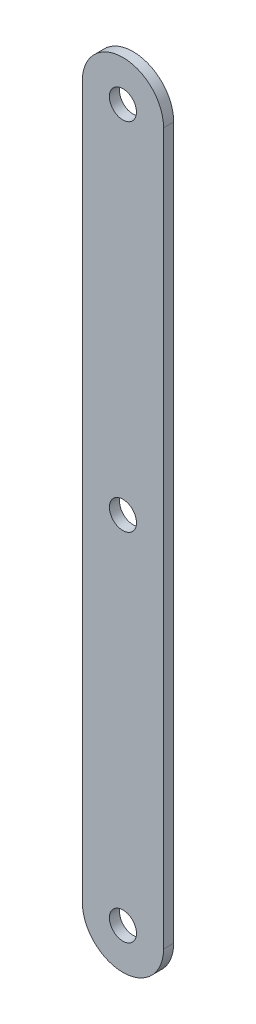
ISO-10303-21;
HEADER;
FILE_DESCRIPTION(('STEP AP214'),'2;1');
FILE_NAME('part.step','',(''),(''),'','','');
FILE_SCHEMA(('AUTOMOTIVE_DESIGN { 1 0 10303 214 1 1 1 1 }'));
ENDSEC;
DATA;
#1=APPLICATION_CONTEXT('core data for automotive mechanical design processes');
#2=APPLICATION_PROTOCOL_DEFINITION('international standard','automotive_design',2000,#1);
#3=PRODUCT_CONTEXT('',#1,'mechanical');
#4=PRODUCT('Part','Part','',(#3));
#5=PRODUCT_RELATED_PRODUCT_CATEGORY('part','',(#4));
#6=PRODUCT_DEFINITION_FORMATION('','',#4);
#7=PRODUCT_DEFINITION_CONTEXT('part definition',#1,'design');
#8=PRODUCT_DEFINITION('design','',#6,#7);
#9=PRODUCT_DEFINITION_SHAPE('','',#8);
#10=(LENGTH_UNIT() NAMED_UNIT(*) SI_UNIT(.MILLI.,.METRE.));
#11=(NAMED_UNIT(*) PLANE_ANGLE_UNIT() SI_UNIT($,.RADIAN.));
#12=(NAMED_UNIT(*) SI_UNIT($,.STERADIAN.) SOLID_ANGLE_UNIT());
#13=UNCERTAINTY_MEASURE_WITH_UNIT(LENGTH_MEASURE(1.E-05),#10,'distance_accuracy_value','');
#14=(GEOMETRIC_REPRESENTATION_CONTEXT(3) GLOBAL_UNCERTAINTY_ASSIGNED_CONTEXT((#13)) GLOBAL_UNIT_ASSIGNED_CONTEXT((#10,
#11,#12)) REPRESENTATION_CONTEXT('',''));
#15=CARTESIAN_POINT('',(0.,0.,0.));
#16=DIRECTION('',(0.,0.,1.));
#17=DIRECTION('',(1.,0.,0.));
#18=AXIS2_PLACEMENT_3D('',#15,#16,#17);
#19=CARTESIAN_POINT('',(0.,-105.,1.5));
#20=DIRECTION('',(0.,0.,-1.));
#21=DIRECTION('',(-1.,0.,0.));
#22=AXIS2_PLACEMENT_3D('',#19,#20,#21);
#23=CYLINDRICAL_SURFACE('',#22,12.);
#24=CARTESIAN_POINT('',(0.,-105.,-1.5));
#25=DIRECTION('',(0.,0.,-1.));
#26=DIRECTION('',(-1.,0.,0.));
#27=AXIS2_PLACEMENT_3D('',#24,#25,#26);
#28=CIRCLE('',#27,12.);
#29=CARTESIAN_POINT('',(12.,-105.,-1.5));
#30=VERTEX_POINT('',#29);
#31=CARTESIAN_POINT('',(-12.,-105.,-1.5));
#32=VERTEX_POINT('',#31);
#33=EDGE_CURVE('E110',#30,#32,#28,.T.);
#34=ORIENTED_EDGE('',*,*,#33,.F.);
#35=DIRECTION('',(0.,0.,-1.));
#36=VECTOR('',#35,1.);
#37=CARTESIAN_POINT('',(12.,-105.,1.5));
#38=LINE('',#37,#36);
#39=CARTESIAN_POINT('',(12.,-105.,1.5));
#40=VERTEX_POINT('',#39);
#41=EDGE_CURVE('E13',#40,#30,#38,.T.);
#42=ORIENTED_EDGE('',*,*,#41,.F.);
#43=CARTESIAN_POINT('',(0.,-105.,1.5));
#44=DIRECTION('',(0.,0.,-1.));
#45=DIRECTION('',(-1.,0.,0.));
#46=AXIS2_PLACEMENT_3D('',#43,#44,#45);
#47=CIRCLE('',#46,12.);
#48=CARTESIAN_POINT('',(-12.,-105.,1.5));
#49=VERTEX_POINT('',#48);
#50=EDGE_CURVE('E103',#40,#49,#47,.T.);
#51=ORIENTED_EDGE('',*,*,#50,.T.);
#52=DIRECTION('',(0.,0.,-1.));
#53=VECTOR('',#52,1.);
#54=CARTESIAN_POINT('',(-12.,-105.,1.5));
#55=LINE('',#54,#53);
#56=EDGE_CURVE('E48',#49,#32,#55,.T.);
#57=ORIENTED_EDGE('',*,*,#56,.T.);
#58=EDGE_LOOP('',(#34,#42,#51,#57));
#59=FACE_BOUND('',#58,.T.);
#60=ADVANCED_FACE('F45',(#59),#23,.T.);
#61=CARTESIAN_POINT('',(12.,105.,1.5));
#62=DIRECTION('',(1.,0.,0.));
#63=DIRECTION('',(0.,0.,-1.));
#64=AXIS2_PLACEMENT_3D('',#61,#62,#63);
#65=PLANE('',#64);
#66=DIRECTION('',(0.,-1.,0.));
#67=VECTOR('',#66,1.);
#68=CARTESIAN_POINT('',(12.,105.,-1.5));
#69=LINE('',#68,#67);
#70=CARTESIAN_POINT('',(12.,105.,-1.5));
#71=VERTEX_POINT('',#70);
#72=EDGE_CURVE('E105',#71,#30,#69,.T.);
#73=ORIENTED_EDGE('',*,*,#72,.F.);
#74=DIRECTION('',(0.,0.,-1.));
#75=VECTOR('',#74,1.);
#76=CARTESIAN_POINT('',(12.,105.,1.5));
#77=LINE('',#76,#75);
#78=CARTESIAN_POINT('',(12.,105.,1.5));
#79=VERTEX_POINT('',#78);
#80=EDGE_CURVE('E54',#79,#71,#77,.T.);
#81=ORIENTED_EDGE('',*,*,#80,.F.);
#82=DIRECTION('',(0.,-1.,0.));
#83=VECTOR('',#82,1.);
#84=CARTESIAN_POINT('',(12.,105.,1.5));
#85=LINE('',#84,#83);
#86=EDGE_CURVE('E100',#79,#40,#85,.T.);
#87=ORIENTED_EDGE('',*,*,#86,.T.);
#88=ORIENTED_EDGE('',*,*,#41,.T.);
#89=EDGE_LOOP('',(#73,#81,#87,#88));
#90=FACE_BOUND('',#89,.T.);
#91=ADVANCED_FACE('F121',(#90),#65,.T.);
#92=CARTESIAN_POINT('',(0.,105.,1.5));
#93=DIRECTION('',(0.,0.,-1.));
#94=DIRECTION('',(-1.,0.,0.));
#95=AXIS2_PLACEMENT_3D('',#92,#93,#94);
#96=CYLINDRICAL_SURFACE('',#95,12.);
#97=CARTESIAN_POINT('',(0.,105.,-1.5));
#98=DIRECTION('',(0.,0.,-1.));
#99=DIRECTION('',(-1.,0.,0.));
#100=AXIS2_PLACEMENT_3D('',#97,#98,#99);
#101=CIRCLE('',#100,12.);
#102=CARTESIAN_POINT('',(-12.,105.,-1.5));
#103=VERTEX_POINT('',#102);
#104=EDGE_CURVE('E95',#103,#71,#101,.T.);
#105=ORIENTED_EDGE('',*,*,#104,.F.);
#106=DIRECTION('',(0.,0.,-1.));
#107=VECTOR('',#106,1.);
#108=CARTESIAN_POINT('',(-12.,105.,1.5));
#109=LINE('',#108,#107);
#110=CARTESIAN_POINT('',(-12.,105.,1.5));
#111=VERTEX_POINT('',#110);
#112=EDGE_CURVE('E90',#111,#103,#109,.T.);
#113=ORIENTED_EDGE('',*,*,#112,.F.);
#114=CARTESIAN_POINT('',(0.,105.,1.5));
#115=DIRECTION('',(0.,0.,-1.));
#116=DIRECTION('',(-1.,0.,0.));
#117=AXIS2_PLACEMENT_3D('',#114,#115,#116);
#118=CIRCLE('',#117,12.);
#119=EDGE_CURVE('E93',#111,#79,#118,.T.);
#120=ORIENTED_EDGE('',*,*,#119,.T.);
#121=ORIENTED_EDGE('',*,*,#80,.T.);
#122=EDGE_LOOP('',(#105,#113,#120,#121));
#123=FACE_BOUND('',#122,.T.);
#124=ADVANCED_FACE('F92',(#123),#96,.T.);
#125=CARTESIAN_POINT('',(-12.,-105.,1.5));
#126=DIRECTION('',(-1.,0.,0.));
#127=DIRECTION('',(0.,0.,1.));
#128=AXIS2_PLACEMENT_3D('',#125,#126,#127);
#129=PLANE('',#128);
#130=DIRECTION('',(0.,1.,0.));
#131=VECTOR('',#130,1.);
#132=CARTESIAN_POINT('',(-12.,-105.,-1.5));
#133=LINE('',#132,#131);
#134=EDGE_CURVE('E113',#32,#103,#133,.T.);
#135=ORIENTED_EDGE('',*,*,#134,.F.);
#136=ORIENTED_EDGE('',*,*,#56,.F.);
#137=DIRECTION('',(0.,1.,0.));
#138=VECTOR('',#137,1.);
#139=CARTESIAN_POINT('',(-12.,-105.,1.5));
#140=LINE('',#139,#138);
#141=EDGE_CURVE('E99',#49,#111,#140,.T.);
#142=ORIENTED_EDGE('',*,*,#141,.T.);
#143=ORIENTED_EDGE('',*,*,#112,.T.);
#144=EDGE_LOOP('',(#135,#136,#142,#143));
#145=FACE_BOUND('',#144,.T.);
#146=ADVANCED_FACE('F102',(#145),#129,.T.);
#147=CARTESIAN_POINT('',(0.,-105.,1.5));
#148=DIRECTION('',(0.,0.,-1.));
#149=DIRECTION('',(-1.,0.,0.));
#150=AXIS2_PLACEMENT_3D('',#147,#148,#149);
#151=PLANE('',#150);
#152=CARTESIAN_POINT('',(0.,105.,1.5));
#153=DIRECTION('',(0.,0.,-1.));
#154=DIRECTION('',(1.,0.,0.));
#155=AXIS2_PLACEMENT_3D('',#152,#153,#154);
#156=CIRCLE('',#155,4.);
#157=CARTESIAN_POINT('',(3.99999999999999,105.,1.5));
#158=VERTEX_POINT('',#157);
#159=EDGE_CURVE('E158',#158,#158,#156,.T.);
#160=ORIENTED_EDGE('',*,*,#159,.T.);
#161=EDGE_LOOP('',(#160));
#162=FACE_BOUND('',#161,.T.);
#163=CARTESIAN_POINT('',(0.,0.,1.5));
#164=DIRECTION('',(0.,0.,-1.));
#165=DIRECTION('',(1.,0.,0.));
#166=AXIS2_PLACEMENT_3D('',#163,#164,#165);
#167=CIRCLE('',#166,4.);
#168=CARTESIAN_POINT('',(4.,0.,1.5));
#169=VERTEX_POINT('',#168);
#170=EDGE_CURVE('E166',#169,#169,#167,.T.);
#171=ORIENTED_EDGE('',*,*,#170,.T.);
#172=EDGE_LOOP('',(#171));
#173=FACE_BOUND('',#172,.T.);
#174=CARTESIAN_POINT('',(0.,-105.,1.5));
#175=DIRECTION('',(0.,0.,-1.));
#176=DIRECTION('',(1.,0.,0.));
#177=AXIS2_PLACEMENT_3D('',#174,#175,#176);
#178=CIRCLE('',#177,4.);
#179=CARTESIAN_POINT('',(4.,-105.,1.5));
#180=VERTEX_POINT('',#179);
#181=EDGE_CURVE('E114',#180,#180,#178,.T.);
#182=ORIENTED_EDGE('',*,*,#181,.T.);
#183=EDGE_LOOP('',(#182));
#184=FACE_BOUND('',#183,.T.);
#185=ORIENTED_EDGE('',*,*,#50,.F.);
#186=ORIENTED_EDGE('',*,*,#86,.F.);
#187=ORIENTED_EDGE('',*,*,#119,.F.);
#188=ORIENTED_EDGE('',*,*,#141,.F.);
#189=EDGE_LOOP('',(#185,#186,#187,#188));
#190=FACE_BOUND('',#189,.T.);
#191=ADVANCED_FACE('F98',(#162,#173,#184,#190),#151,.F.);
#192=CARTESIAN_POINT('',(0.,-105.,-1.5));
#193=DIRECTION('',(0.,0.,-1.));
#194=DIRECTION('',(-1.,0.,0.));
#195=AXIS2_PLACEMENT_3D('',#192,#193,#194);
#196=PLANE('',#195);
#197=CARTESIAN_POINT('',(0.,105.,-1.5));
#198=DIRECTION('',(0.,0.,-1.));
#199=DIRECTION('',(1.,0.,0.));
#200=AXIS2_PLACEMENT_3D('',#197,#198,#199);
#201=CIRCLE('',#200,4.);
#202=CARTESIAN_POINT('',(3.99999999999999,105.,-1.5));
#203=VERTEX_POINT('',#202);
#204=EDGE_CURVE('E161',#203,#203,#201,.T.);
#205=ORIENTED_EDGE('',*,*,#204,.F.);
#206=EDGE_LOOP('',(#205));
#207=FACE_BOUND('',#206,.T.);
#208=CARTESIAN_POINT('',(0.,0.,-1.5));
#209=DIRECTION('',(0.,0.,-1.));
#210=DIRECTION('',(1.,0.,0.));
#211=AXIS2_PLACEMENT_3D('',#208,#209,#210);
#212=CIRCLE('',#211,4.);
#213=CARTESIAN_POINT('',(4.,0.,-1.5));
#214=VERTEX_POINT('',#213);
#215=EDGE_CURVE('E163',#214,#214,#212,.T.);
#216=ORIENTED_EDGE('',*,*,#215,.F.);
#217=EDGE_LOOP('',(#216));
#218=FACE_BOUND('',#217,.T.);
#219=CARTESIAN_POINT('',(0.,-105.,-1.5));
#220=DIRECTION('',(0.,0.,-1.));
#221=DIRECTION('',(1.,0.,0.));
#222=AXIS2_PLACEMENT_3D('',#219,#220,#221);
#223=CIRCLE('',#222,4.);
#224=CARTESIAN_POINT('',(4.,-105.,-1.5));
#225=VERTEX_POINT('',#224);
#226=EDGE_CURVE('E169',#225,#225,#223,.T.);
#227=ORIENTED_EDGE('',*,*,#226,.F.);
#228=EDGE_LOOP('',(#227));
#229=FACE_BOUND('',#228,.T.);
#230=ORIENTED_EDGE('',*,*,#33,.T.);
#231=ORIENTED_EDGE('',*,*,#134,.T.);
#232=ORIENTED_EDGE('',*,*,#104,.T.);
#233=ORIENTED_EDGE('',*,*,#72,.T.);
#234=EDGE_LOOP('',(#230,#231,#232,#233));
#235=FACE_BOUND('',#234,.T.);
#236=ADVANCED_FACE('F120',(#207,#218,#229,#235),#196,.T.);
#237=CARTESIAN_POINT('',(0.,-105.,1.5));
#238=DIRECTION('',(0.,0.,-1.));
#239=DIRECTION('',(-1.,0.,0.));
#240=AXIS2_PLACEMENT_3D('',#237,#238,#239);
#241=CYLINDRICAL_SURFACE('',#240,4.);
#242=ORIENTED_EDGE('',*,*,#181,.F.);
#243=EDGE_LOOP('',(#242));
#244=FACE_BOUND('',#243,.T.);
#245=ORIENTED_EDGE('',*,*,#226,.T.);
#246=EDGE_LOOP('',(#245));
#247=FACE_BOUND('',#246,.T.);
#248=ADVANCED_FACE('F139',(#244,#247),#241,.F.);
#249=CARTESIAN_POINT('',(0.,0.,1.5));
#250=DIRECTION('',(0.,0.,-1.));
#251=DIRECTION('',(-1.,0.,0.));
#252=AXIS2_PLACEMENT_3D('',#249,#250,#251);
#253=CYLINDRICAL_SURFACE('',#252,4.);
#254=ORIENTED_EDGE('',*,*,#170,.F.);
#255=EDGE_LOOP('',(#254));
#256=FACE_BOUND('',#255,.T.);
#257=ORIENTED_EDGE('',*,*,#215,.T.);
#258=EDGE_LOOP('',(#257));
#259=FACE_BOUND('',#258,.T.);
#260=ADVANCED_FACE('F146',(#256,#259),#253,.F.);
#261=CARTESIAN_POINT('',(0.,105.,1.5));
#262=DIRECTION('',(0.,0.,-1.));
#263=DIRECTION('',(-1.,0.,0.));
#264=AXIS2_PLACEMENT_3D('',#261,#262,#263);
#265=CYLINDRICAL_SURFACE('',#264,4.);
#266=ORIENTED_EDGE('',*,*,#159,.F.);
#267=EDGE_LOOP('',(#266));
#268=FACE_BOUND('',#267,.T.);
#269=ORIENTED_EDGE('',*,*,#204,.T.);
#270=EDGE_LOOP('',(#269));
#271=FACE_BOUND('',#270,.T.);
#272=ADVANCED_FACE('F150',(#268,#271),#265,.F.);
#273=CLOSED_SHELL('',(#60,#91,#124,#146,#191,#236,#248,#260,#272));
#274=MANIFOLD_SOLID_BREP('B2',#273);
#275=ADVANCED_BREP_SHAPE_REPRESENTATION('',(#18,#274),#14);
#276=SHAPE_DEFINITION_REPRESENTATION(#9,#275);
ENDSEC;
END-ISO-10303-21;
